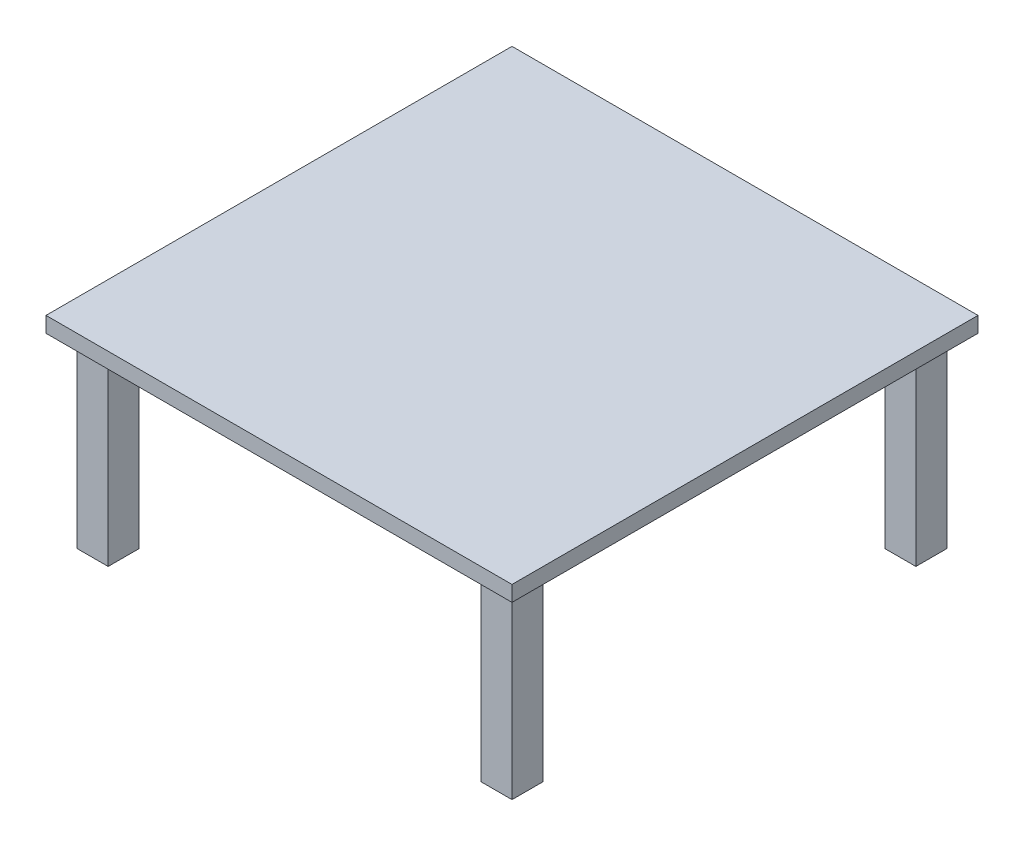
ISO-10303-21;
HEADER;
FILE_DESCRIPTION(('STEP AP214'),'2;1');
FILE_NAME('part.step','',(''),(''),'','','');
FILE_SCHEMA(('AUTOMOTIVE_DESIGN { 1 0 10303 214 1 1 1 1 }'));
ENDSEC;
DATA;
#1=APPLICATION_CONTEXT('core data for automotive mechanical design processes');
#2=APPLICATION_PROTOCOL_DEFINITION('international standard','automotive_design',2000,#1);
#3=PRODUCT_CONTEXT('',#1,'mechanical');
#4=PRODUCT('Part','Part','',(#3));
#5=PRODUCT_RELATED_PRODUCT_CATEGORY('part','',(#4));
#6=PRODUCT_DEFINITION_FORMATION('','',#4);
#7=PRODUCT_DEFINITION_CONTEXT('part definition',#1,'design');
#8=PRODUCT_DEFINITION('design','',#6,#7);
#9=PRODUCT_DEFINITION_SHAPE('','',#8);
#10=(LENGTH_UNIT() NAMED_UNIT(*) SI_UNIT(.MILLI.,.METRE.));
#11=(NAMED_UNIT(*) PLANE_ANGLE_UNIT() SI_UNIT($,.RADIAN.));
#12=(NAMED_UNIT(*) SI_UNIT($,.STERADIAN.) SOLID_ANGLE_UNIT());
#13=UNCERTAINTY_MEASURE_WITH_UNIT(LENGTH_MEASURE(1.E-05),#10,'distance_accuracy_value','');
#14=(GEOMETRIC_REPRESENTATION_CONTEXT(3) GLOBAL_UNCERTAINTY_ASSIGNED_CONTEXT((#13)) GLOBAL_UNIT_ASSIGNED_CONTEXT((#10,
#11,#12)) REPRESENTATION_CONTEXT('',''));
#15=CARTESIAN_POINT('',(0.,0.,0.));
#16=DIRECTION('',(0.,0.,1.));
#17=DIRECTION('',(1.,0.,0.));
#18=AXIS2_PLACEMENT_3D('',#15,#16,#17);
#19=CARTESIAN_POINT('',(0.,0.,0.));
#20=DIRECTION('',(0.,1.,0.));
#21=DIRECTION('',(0.,0.,1.));
#22=AXIS2_PLACEMENT_3D('',#19,#20,#21);
#23=PLANE('',#22);
#24=DIRECTION('',(1.,0.,0.));
#25=VECTOR('',#24,1.);
#26=CARTESIAN_POINT('',(14.,0.,-14.));
#27=LINE('',#26,#25);
#28=CARTESIAN_POINT('',(12.,0.,-14.));
#29=VERTEX_POINT('',#28);
#30=CARTESIAN_POINT('',(14.,0.,-14.));
#31=VERTEX_POINT('',#30);
#32=EDGE_CURVE('E191',#29,#31,#27,.T.);
#33=ORIENTED_EDGE('',*,*,#32,.F.);
#34=DIRECTION('',(0.,0.,-1.));
#35=VECTOR('',#34,1.);
#36=CARTESIAN_POINT('',(12.,0.,-14.));
#37=LINE('',#36,#35);
#38=CARTESIAN_POINT('',(12.,0.,-12.));
#39=VERTEX_POINT('',#38);
#40=EDGE_CURVE('E204',#39,#29,#37,.T.);
#41=ORIENTED_EDGE('',*,*,#40,.F.);
#42=DIRECTION('',(-1.,0.,0.));
#43=VECTOR('',#42,1.);
#44=CARTESIAN_POINT('',(14.,0.,-12.));
#45=LINE('',#44,#43);
#46=CARTESIAN_POINT('',(14.,0.,-12.));
#47=VERTEX_POINT('',#46);
#48=EDGE_CURVE('E213',#47,#39,#45,.T.);
#49=ORIENTED_EDGE('',*,*,#48,.F.);
#50=DIRECTION('',(0.,0.,1.));
#51=VECTOR('',#50,1.);
#52=CARTESIAN_POINT('',(14.,0.,-14.));
#53=LINE('',#52,#51);
#54=EDGE_CURVE('E194',#31,#47,#53,.T.);
#55=ORIENTED_EDGE('',*,*,#54,.F.);
#56=EDGE_LOOP('',(#33,#41,#49,#55));
#57=FACE_BOUND('',#56,.T.);
#58=DIRECTION('',(0.,0.,-1.));
#59=VECTOR('',#58,1.);
#60=CARTESIAN_POINT('',(-14.,0.,14.));
#61=LINE('',#60,#59);
#62=CARTESIAN_POINT('',(-14.,0.,14.));
#63=VERTEX_POINT('',#62);
#64=CARTESIAN_POINT('',(-14.,0.,12.));
#65=VERTEX_POINT('',#64);
#66=EDGE_CURVE('E262',#63,#65,#61,.T.);
#67=ORIENTED_EDGE('',*,*,#66,.F.);
#68=DIRECTION('',(-1.,0.,0.));
#69=VECTOR('',#68,1.);
#70=CARTESIAN_POINT('',(-14.,0.,14.));
#71=LINE('',#70,#69);
#72=CARTESIAN_POINT('',(-12.,0.,14.));
#73=VERTEX_POINT('',#72);
#74=EDGE_CURVE('E267',#73,#63,#71,.T.);
#75=ORIENTED_EDGE('',*,*,#74,.F.);
#76=DIRECTION('',(0.,0.,1.));
#77=VECTOR('',#76,1.);
#78=CARTESIAN_POINT('',(-12.,0.,14.));
#79=LINE('',#78,#77);
#80=CARTESIAN_POINT('',(-12.,0.,12.));
#81=VERTEX_POINT('',#80);
#82=EDGE_CURVE('E279',#81,#73,#79,.T.);
#83=ORIENTED_EDGE('',*,*,#82,.F.);
#84=DIRECTION('',(1.,0.,0.));
#85=VECTOR('',#84,1.);
#86=CARTESIAN_POINT('',(-14.,0.,12.));
#87=LINE('',#86,#85);
#88=EDGE_CURVE('E276',#65,#81,#87,.T.);
#89=ORIENTED_EDGE('',*,*,#88,.F.);
#90=EDGE_LOOP('',(#67,#75,#83,#89));
#91=FACE_BOUND('',#90,.T.);
#92=DIRECTION('',(0.,0.,-1.));
#93=VECTOR('',#92,1.);
#94=CARTESIAN_POINT('',(15.,0.,-15.));
#95=LINE('',#94,#93);
#96=CARTESIAN_POINT('',(15.,0.,15.));
#97=VERTEX_POINT('',#96);
#98=CARTESIAN_POINT('',(15.,0.,-15.));
#99=VERTEX_POINT('',#98);
#100=EDGE_CURVE('E295',#97,#99,#95,.T.);
#101=ORIENTED_EDGE('',*,*,#100,.F.);
#102=DIRECTION('',(1.,0.,0.));
#103=VECTOR('',#102,1.);
#104=CARTESIAN_POINT('',(-15.,0.,15.));
#105=LINE('',#104,#103);
#106=CARTESIAN_POINT('',(-15.,0.,15.));
#107=VERTEX_POINT('',#106);
#108=EDGE_CURVE('E300',#107,#97,#105,.T.);
#109=ORIENTED_EDGE('',*,*,#108,.F.);
#110=DIRECTION('',(0.,0.,1.));
#111=VECTOR('',#110,1.);
#112=CARTESIAN_POINT('',(-15.,0.,-15.));
#113=LINE('',#112,#111);
#114=CARTESIAN_POINT('',(-15.,0.,-15.));
#115=VERTEX_POINT('',#114);
#116=EDGE_CURVE('E311',#115,#107,#113,.T.);
#117=ORIENTED_EDGE('',*,*,#116,.F.);
#118=DIRECTION('',(-1.,0.,0.));
#119=VECTOR('',#118,1.);
#120=CARTESIAN_POINT('',(-15.,0.,-15.));
#121=LINE('',#120,#119);
#122=EDGE_CURVE('E309',#99,#115,#121,.T.);
#123=ORIENTED_EDGE('',*,*,#122,.F.);
#124=EDGE_LOOP('',(#101,#109,#117,#123));
#125=FACE_BOUND('',#124,.T.);
#126=DIRECTION('',(0.,0.,1.));
#127=VECTOR('',#126,1.);
#128=CARTESIAN_POINT('',(14.,0.,14.));
#129=LINE('',#128,#127);
#130=CARTESIAN_POINT('',(14.,0.,12.));
#131=VERTEX_POINT('',#130);
#132=CARTESIAN_POINT('',(14.,0.,14.));
#133=VERTEX_POINT('',#132);
#134=EDGE_CURVE('E229',#131,#133,#129,.T.);
#135=ORIENTED_EDGE('',*,*,#134,.F.);
#136=DIRECTION('',(1.,0.,0.));
#137=VECTOR('',#136,1.);
#138=CARTESIAN_POINT('',(14.,0.,12.));
#139=LINE('',#138,#137);
#140=CARTESIAN_POINT('',(12.,0.,12.));
#141=VERTEX_POINT('',#140);
#142=EDGE_CURVE('E234',#141,#131,#139,.T.);
#143=ORIENTED_EDGE('',*,*,#142,.F.);
#144=DIRECTION('',(0.,0.,-1.));
#145=VECTOR('',#144,1.);
#146=CARTESIAN_POINT('',(12.,0.,14.));
#147=LINE('',#146,#145);
#148=CARTESIAN_POINT('',(12.,0.,14.));
#149=VERTEX_POINT('',#148);
#150=EDGE_CURVE('E246',#149,#141,#147,.T.);
#151=ORIENTED_EDGE('',*,*,#150,.F.);
#152=DIRECTION('',(-1.,0.,0.));
#153=VECTOR('',#152,1.);
#154=CARTESIAN_POINT('',(14.,0.,14.));
#155=LINE('',#154,#153);
#156=EDGE_CURVE('E243',#133,#149,#155,.T.);
#157=ORIENTED_EDGE('',*,*,#156,.F.);
#158=EDGE_LOOP('',(#135,#143,#151,#157));
#159=FACE_BOUND('',#158,.T.);
#160=DIRECTION('',(0.,0.,-1.));
#161=VECTOR('',#160,1.);
#162=CARTESIAN_POINT('',(-14.,0.,-14.));
#163=LINE('',#162,#161);
#164=CARTESIAN_POINT('',(-14.,0.,-12.));
#165=VERTEX_POINT('',#164);
#166=CARTESIAN_POINT('',(-14.,0.,-14.));
#167=VERTEX_POINT('',#166);
#168=EDGE_CURVE('E190',#165,#167,#163,.T.);
#169=ORIENTED_EDGE('',*,*,#168,.F.);
#170=DIRECTION('',(-1.,0.,0.));
#171=VECTOR('',#170,1.);
#172=CARTESIAN_POINT('',(-14.,0.,-12.));
#173=LINE('',#172,#171);
#174=CARTESIAN_POINT('',(-12.,0.,-12.));
#175=VERTEX_POINT('',#174);
#176=EDGE_CURVE('E187',#175,#165,#173,.T.);
#177=ORIENTED_EDGE('',*,*,#176,.F.);
#178=DIRECTION('',(0.,0.,1.));
#179=VECTOR('',#178,1.);
#180=CARTESIAN_POINT('',(-12.,0.,-14.));
#181=LINE('',#180,#179);
#182=CARTESIAN_POINT('',(-12.,0.,-14.));
#183=VERTEX_POINT('',#182);
#184=EDGE_CURVE('E53',#183,#175,#181,.T.);
#185=ORIENTED_EDGE('',*,*,#184,.F.);
#186=DIRECTION('',(1.,0.,0.));
#187=VECTOR('',#186,1.);
#188=CARTESIAN_POINT('',(-14.,0.,-14.));
#189=LINE('',#188,#187);
#190=EDGE_CURVE('E48',#167,#183,#189,.T.);
#191=ORIENTED_EDGE('',*,*,#190,.F.);
#192=EDGE_LOOP('',(#169,#177,#185,#191));
#193=FACE_BOUND('',#192,.T.);
#194=ADVANCED_FACE('F33',(#57,#91,#125,#159,#193),#23,.F.);
#195=CARTESIAN_POINT('',(15.,1.,-15.));
#196=DIRECTION('',(-1.,0.,0.));
#197=DIRECTION('',(0.,0.,1.));
#198=AXIS2_PLACEMENT_3D('',#195,#196,#197);
#199=PLANE('',#198);
#200=ORIENTED_EDGE('',*,*,#100,.T.);
#201=DIRECTION('',(0.,-1.,0.));
#202=VECTOR('',#201,1.);
#203=CARTESIAN_POINT('',(15.,1.,-15.));
#204=LINE('',#203,#202);
#205=CARTESIAN_POINT('',(15.,1.,-15.));
#206=VERTEX_POINT('',#205);
#207=EDGE_CURVE('E11',#206,#99,#204,.T.);
#208=ORIENTED_EDGE('',*,*,#207,.F.);
#209=DIRECTION('',(0.,0.,-1.));
#210=VECTOR('',#209,1.);
#211=CARTESIAN_POINT('',(15.,1.,-15.));
#212=LINE('',#211,#210);
#213=CARTESIAN_POINT('',(15.,1.,15.));
#214=VERTEX_POINT('',#213);
#215=EDGE_CURVE('E296',#214,#206,#212,.T.);
#216=ORIENTED_EDGE('',*,*,#215,.F.);
#217=DIRECTION('',(0.,-1.,0.));
#218=VECTOR('',#217,1.);
#219=CARTESIAN_POINT('',(15.,1.,15.));
#220=LINE('',#219,#218);
#221=EDGE_CURVE('E306',#214,#97,#220,.T.);
#222=ORIENTED_EDGE('',*,*,#221,.T.);
#223=EDGE_LOOP('',(#200,#208,#216,#222));
#224=FACE_BOUND('',#223,.T.);
#225=ADVANCED_FACE('F35',(#224),#199,.F.);
#226=CARTESIAN_POINT('',(-15.,1.,-15.));
#227=DIRECTION('',(0.,0.,1.));
#228=DIRECTION('',(1.,0.,0.));
#229=AXIS2_PLACEMENT_3D('',#226,#227,#228);
#230=PLANE('',#229);
#231=ORIENTED_EDGE('',*,*,#122,.T.);
#232=DIRECTION('',(0.,-1.,0.));
#233=VECTOR('',#232,1.);
#234=CARTESIAN_POINT('',(-15.,1.,-15.));
#235=LINE('',#234,#233);
#236=CARTESIAN_POINT('',(-15.,1.,-15.));
#237=VERTEX_POINT('',#236);
#238=EDGE_CURVE('E41',#237,#115,#235,.T.);
#239=ORIENTED_EDGE('',*,*,#238,.F.);
#240=DIRECTION('',(-1.,0.,0.));
#241=VECTOR('',#240,1.);
#242=CARTESIAN_POINT('',(-15.,1.,-15.));
#243=LINE('',#242,#241);
#244=EDGE_CURVE('E299',#206,#237,#243,.T.);
#245=ORIENTED_EDGE('',*,*,#244,.F.);
#246=ORIENTED_EDGE('',*,*,#207,.T.);
#247=EDGE_LOOP('',(#231,#239,#245,#246));
#248=FACE_BOUND('',#247,.T.);
#249=ADVANCED_FACE('F339',(#248),#230,.F.);
#250=CARTESIAN_POINT('',(-15.,1.,-15.));
#251=DIRECTION('',(1.,0.,0.));
#252=DIRECTION('',(0.,0.,-1.));
#253=AXIS2_PLACEMENT_3D('',#250,#251,#252);
#254=PLANE('',#253);
#255=ORIENTED_EDGE('',*,*,#116,.T.);
#256=DIRECTION('',(0.,-1.,0.));
#257=VECTOR('',#256,1.);
#258=CARTESIAN_POINT('',(-15.,1.,15.));
#259=LINE('',#258,#257);
#260=CARTESIAN_POINT('',(-15.,1.,15.));
#261=VERTEX_POINT('',#260);
#262=EDGE_CURVE('E316',#261,#107,#259,.T.);
#263=ORIENTED_EDGE('',*,*,#262,.F.);
#264=DIRECTION('',(0.,0.,1.));
#265=VECTOR('',#264,1.);
#266=CARTESIAN_POINT('',(-15.,1.,-15.));
#267=LINE('',#266,#265);
#268=EDGE_CURVE('E302',#237,#261,#267,.T.);
#269=ORIENTED_EDGE('',*,*,#268,.F.);
#270=ORIENTED_EDGE('',*,*,#238,.T.);
#271=EDGE_LOOP('',(#255,#263,#269,#270));
#272=FACE_BOUND('',#271,.T.);
#273=ADVANCED_FACE('F323',(#272),#254,.F.);
#274=CARTESIAN_POINT('',(-15.,1.,15.));
#275=DIRECTION('',(0.,0.,-1.));
#276=DIRECTION('',(-1.,0.,0.));
#277=AXIS2_PLACEMENT_3D('',#274,#275,#276);
#278=PLANE('',#277);
#279=ORIENTED_EDGE('',*,*,#108,.T.);
#280=ORIENTED_EDGE('',*,*,#221,.F.);
#281=DIRECTION('',(1.,0.,0.));
#282=VECTOR('',#281,1.);
#283=CARTESIAN_POINT('',(-15.,1.,15.));
#284=LINE('',#283,#282);
#285=EDGE_CURVE('E304',#261,#214,#284,.T.);
#286=ORIENTED_EDGE('',*,*,#285,.F.);
#287=ORIENTED_EDGE('',*,*,#262,.T.);
#288=EDGE_LOOP('',(#279,#280,#286,#287));
#289=FACE_BOUND('',#288,.T.);
#290=ADVANCED_FACE('F332',(#289),#278,.F.);
#291=CARTESIAN_POINT('',(0.,1.,0.));
#292=DIRECTION('',(0.,1.,0.));
#293=DIRECTION('',(0.,0.,1.));
#294=AXIS2_PLACEMENT_3D('',#291,#292,#293);
#295=PLANE('',#294);
#296=ORIENTED_EDGE('',*,*,#215,.T.);
#297=ORIENTED_EDGE('',*,*,#244,.T.);
#298=ORIENTED_EDGE('',*,*,#268,.T.);
#299=ORIENTED_EDGE('',*,*,#285,.T.);
#300=EDGE_LOOP('',(#296,#297,#298,#299));
#301=FACE_BOUND('',#300,.T.);
#302=ADVANCED_FACE('F338',(#301),#295,.T.);
#303=CARTESIAN_POINT('',(-14.,-12.,14.));
#304=DIRECTION('',(1.,0.,0.));
#305=DIRECTION('',(0.,0.,-1.));
#306=AXIS2_PLACEMENT_3D('',#303,#304,#305);
#307=PLANE('',#306);
#308=ORIENTED_EDGE('',*,*,#66,.T.);
#309=DIRECTION('',(0.,1.,0.));
#310=VECTOR('',#309,1.);
#311=CARTESIAN_POINT('',(-14.,-12.,12.));
#312=LINE('',#311,#310);
#313=CARTESIAN_POINT('',(-14.,-12.,12.));
#314=VERTEX_POINT('',#313);
#315=EDGE_CURVE('E292',#314,#65,#312,.T.);
#316=ORIENTED_EDGE('',*,*,#315,.F.);
#317=DIRECTION('',(0.,0.,-1.));
#318=VECTOR('',#317,1.);
#319=CARTESIAN_POINT('',(-14.,-12.,14.));
#320=LINE('',#319,#318);
#321=CARTESIAN_POINT('',(-14.,-12.,14.));
#322=VERTEX_POINT('',#321);
#323=EDGE_CURVE('E263',#322,#314,#320,.T.);
#324=ORIENTED_EDGE('',*,*,#323,.F.);
#325=DIRECTION('',(0.,1.,0.));
#326=VECTOR('',#325,1.);
#327=CARTESIAN_POINT('',(-14.,-12.,14.));
#328=LINE('',#327,#326);
#329=EDGE_CURVE('E273',#322,#63,#328,.T.);
#330=ORIENTED_EDGE('',*,*,#329,.T.);
#331=EDGE_LOOP('',(#308,#316,#324,#330));
#332=FACE_BOUND('',#331,.T.);
#333=ADVANCED_FACE('F359',(#332),#307,.F.);
#334=CARTESIAN_POINT('',(-14.,-12.,12.));
#335=DIRECTION('',(0.,0.,1.));
#336=DIRECTION('',(1.,0.,0.));
#337=AXIS2_PLACEMENT_3D('',#334,#335,#336);
#338=PLANE('',#337);
#339=ORIENTED_EDGE('',*,*,#88,.T.);
#340=DIRECTION('',(0.,1.,0.));
#341=VECTOR('',#340,1.);
#342=CARTESIAN_POINT('',(-12.,-12.,12.));
#343=LINE('',#342,#341);
#344=CARTESIAN_POINT('',(-12.,-12.,12.));
#345=VERTEX_POINT('',#344);
#346=EDGE_CURVE('E289',#345,#81,#343,.T.);
#347=ORIENTED_EDGE('',*,*,#346,.F.);
#348=DIRECTION('',(1.,0.,0.));
#349=VECTOR('',#348,1.);
#350=CARTESIAN_POINT('',(-14.,-12.,12.));
#351=LINE('',#350,#349);
#352=EDGE_CURVE('E266',#314,#345,#351,.T.);
#353=ORIENTED_EDGE('',*,*,#352,.F.);
#354=ORIENTED_EDGE('',*,*,#315,.T.);
#355=EDGE_LOOP('',(#339,#347,#353,#354));
#356=FACE_BOUND('',#355,.T.);
#357=ADVANCED_FACE('F363',(#356),#338,.F.);
#358=CARTESIAN_POINT('',(-12.,-12.,14.));
#359=DIRECTION('',(-1.,0.,0.));
#360=DIRECTION('',(0.,0.,1.));
#361=AXIS2_PLACEMENT_3D('',#358,#359,#360);
#362=PLANE('',#361);
#363=ORIENTED_EDGE('',*,*,#82,.T.);
#364=DIRECTION('',(0.,1.,0.));
#365=VECTOR('',#364,1.);
#366=CARTESIAN_POINT('',(-12.,-12.,14.));
#367=LINE('',#366,#365);
#368=CARTESIAN_POINT('',(-12.,-12.,14.));
#369=VERTEX_POINT('',#368);
#370=EDGE_CURVE('E286',#369,#73,#367,.T.);
#371=ORIENTED_EDGE('',*,*,#370,.F.);
#372=DIRECTION('',(0.,0.,1.));
#373=VECTOR('',#372,1.);
#374=CARTESIAN_POINT('',(-12.,-12.,14.));
#375=LINE('',#374,#373);
#376=EDGE_CURVE('E269',#345,#369,#375,.T.);
#377=ORIENTED_EDGE('',*,*,#376,.F.);
#378=ORIENTED_EDGE('',*,*,#346,.T.);
#379=EDGE_LOOP('',(#363,#371,#377,#378));
#380=FACE_BOUND('',#379,.T.);
#381=ADVANCED_FACE('F368',(#380),#362,.F.);
#382=CARTESIAN_POINT('',(-14.,-12.,14.));
#383=DIRECTION('',(0.,0.,-1.));
#384=DIRECTION('',(-1.,0.,0.));
#385=AXIS2_PLACEMENT_3D('',#382,#383,#384);
#386=PLANE('',#385);
#387=ORIENTED_EDGE('',*,*,#74,.T.);
#388=ORIENTED_EDGE('',*,*,#329,.F.);
#389=DIRECTION('',(-1.,0.,0.));
#390=VECTOR('',#389,1.);
#391=CARTESIAN_POINT('',(-14.,-12.,14.));
#392=LINE('',#391,#390);
#393=EDGE_CURVE('E271',#369,#322,#392,.T.);
#394=ORIENTED_EDGE('',*,*,#393,.F.);
#395=ORIENTED_EDGE('',*,*,#370,.T.);
#396=EDGE_LOOP('',(#387,#388,#394,#395));
#397=FACE_BOUND('',#396,.T.);
#398=ADVANCED_FACE('F374',(#397),#386,.F.);
#399=CARTESIAN_POINT('',(0.,-12.,0.));
#400=DIRECTION('',(0.,-1.,0.));
#401=DIRECTION('',(0.,0.,-1.));
#402=AXIS2_PLACEMENT_3D('',#399,#400,#401);
#403=PLANE('',#402);
#404=ORIENTED_EDGE('',*,*,#323,.T.);
#405=ORIENTED_EDGE('',*,*,#352,.T.);
#406=ORIENTED_EDGE('',*,*,#376,.T.);
#407=ORIENTED_EDGE('',*,*,#393,.T.);
#408=EDGE_LOOP('',(#404,#405,#406,#407));
#409=FACE_BOUND('',#408,.T.);
#410=ADVANCED_FACE('F378',(#409),#403,.T.);
#411=CARTESIAN_POINT('',(14.,-12.,14.));
#412=DIRECTION('',(-1.,0.,0.));
#413=DIRECTION('',(0.,0.,1.));
#414=AXIS2_PLACEMENT_3D('',#411,#412,#413);
#415=PLANE('',#414);
#416=ORIENTED_EDGE('',*,*,#134,.T.);
#417=DIRECTION('',(0.,1.,0.));
#418=VECTOR('',#417,1.);
#419=CARTESIAN_POINT('',(14.,-12.,14.));
#420=LINE('',#419,#418);
#421=CARTESIAN_POINT('',(14.,-12.,14.));
#422=VERTEX_POINT('',#421);
#423=EDGE_CURVE('E259',#422,#133,#420,.T.);
#424=ORIENTED_EDGE('',*,*,#423,.F.);
#425=DIRECTION('',(0.,0.,1.));
#426=VECTOR('',#425,1.);
#427=CARTESIAN_POINT('',(14.,-12.,14.));
#428=LINE('',#427,#426);
#429=CARTESIAN_POINT('',(14.,-12.,12.));
#430=VERTEX_POINT('',#429);
#431=EDGE_CURVE('E230',#430,#422,#428,.T.);
#432=ORIENTED_EDGE('',*,*,#431,.F.);
#433=DIRECTION('',(0.,1.,0.));
#434=VECTOR('',#433,1.);
#435=CARTESIAN_POINT('',(14.,-12.,12.));
#436=LINE('',#435,#434);
#437=EDGE_CURVE('E240',#430,#131,#436,.T.);
#438=ORIENTED_EDGE('',*,*,#437,.T.);
#439=EDGE_LOOP('',(#416,#424,#432,#438));
#440=FACE_BOUND('',#439,.T.);
#441=ADVANCED_FACE('F382',(#440),#415,.F.);
#442=CARTESIAN_POINT('',(14.,-12.,14.));
#443=DIRECTION('',(0.,0.,-1.));
#444=DIRECTION('',(-1.,0.,0.));
#445=AXIS2_PLACEMENT_3D('',#442,#443,#444);
#446=PLANE('',#445);
#447=ORIENTED_EDGE('',*,*,#156,.T.);
#448=DIRECTION('',(0.,1.,0.));
#449=VECTOR('',#448,1.);
#450=CARTESIAN_POINT('',(12.,-12.,14.));
#451=LINE('',#450,#449);
#452=CARTESIAN_POINT('',(12.,-12.,14.));
#453=VERTEX_POINT('',#452);
#454=EDGE_CURVE('E256',#453,#149,#451,.T.);
#455=ORIENTED_EDGE('',*,*,#454,.F.);
#456=DIRECTION('',(-1.,0.,0.));
#457=VECTOR('',#456,1.);
#458=CARTESIAN_POINT('',(14.,-12.,14.));
#459=LINE('',#458,#457);
#460=EDGE_CURVE('E233',#422,#453,#459,.T.);
#461=ORIENTED_EDGE('',*,*,#460,.F.);
#462=ORIENTED_EDGE('',*,*,#423,.T.);
#463=EDGE_LOOP('',(#447,#455,#461,#462));
#464=FACE_BOUND('',#463,.T.);
#465=ADVANCED_FACE('F386',(#464),#446,.F.);
#466=CARTESIAN_POINT('',(12.,-12.,14.));
#467=DIRECTION('',(1.,0.,0.));
#468=DIRECTION('',(0.,0.,-1.));
#469=AXIS2_PLACEMENT_3D('',#466,#467,#468);
#470=PLANE('',#469);
#471=ORIENTED_EDGE('',*,*,#150,.T.);
#472=DIRECTION('',(0.,1.,0.));
#473=VECTOR('',#472,1.);
#474=CARTESIAN_POINT('',(12.,-12.,12.));
#475=LINE('',#474,#473);
#476=CARTESIAN_POINT('',(12.,-12.,12.));
#477=VERTEX_POINT('',#476);
#478=EDGE_CURVE('E253',#477,#141,#475,.T.);
#479=ORIENTED_EDGE('',*,*,#478,.F.);
#480=DIRECTION('',(0.,0.,-1.));
#481=VECTOR('',#480,1.);
#482=CARTESIAN_POINT('',(12.,-12.,14.));
#483=LINE('',#482,#481);
#484=EDGE_CURVE('E236',#453,#477,#483,.T.);
#485=ORIENTED_EDGE('',*,*,#484,.F.);
#486=ORIENTED_EDGE('',*,*,#454,.T.);
#487=EDGE_LOOP('',(#471,#479,#485,#486));
#488=FACE_BOUND('',#487,.T.);
#489=ADVANCED_FACE('F390',(#488),#470,.F.);
#490=CARTESIAN_POINT('',(14.,-12.,12.));
#491=DIRECTION('',(0.,0.,1.));
#492=DIRECTION('',(1.,0.,0.));
#493=AXIS2_PLACEMENT_3D('',#490,#491,#492);
#494=PLANE('',#493);
#495=ORIENTED_EDGE('',*,*,#142,.T.);
#496=ORIENTED_EDGE('',*,*,#437,.F.);
#497=DIRECTION('',(1.,0.,0.));
#498=VECTOR('',#497,1.);
#499=CARTESIAN_POINT('',(14.,-12.,12.));
#500=LINE('',#499,#498);
#501=EDGE_CURVE('E238',#477,#430,#500,.T.);
#502=ORIENTED_EDGE('',*,*,#501,.F.);
#503=ORIENTED_EDGE('',*,*,#478,.T.);
#504=EDGE_LOOP('',(#495,#496,#502,#503));
#505=FACE_BOUND('',#504,.T.);
#506=ADVANCED_FACE('F394',(#505),#494,.F.);
#507=CARTESIAN_POINT('',(0.,-12.,0.));
#508=DIRECTION('',(0.,1.,0.));
#509=DIRECTION('',(0.,0.,1.));
#510=AXIS2_PLACEMENT_3D('',#507,#508,#509);
#511=PLANE('',#510);
#512=ORIENTED_EDGE('',*,*,#431,.T.);
#513=ORIENTED_EDGE('',*,*,#460,.T.);
#514=ORIENTED_EDGE('',*,*,#484,.T.);
#515=ORIENTED_EDGE('',*,*,#501,.T.);
#516=EDGE_LOOP('',(#512,#513,#514,#515));
#517=FACE_BOUND('',#516,.T.);
#518=ADVANCED_FACE('F398',(#517),#511,.F.);
#519=CARTESIAN_POINT('',(14.,-12.,-14.));
#520=DIRECTION('',(0.,0.,1.));
#521=DIRECTION('',(1.,0.,0.));
#522=AXIS2_PLACEMENT_3D('',#519,#520,#521);
#523=PLANE('',#522);
#524=ORIENTED_EDGE('',*,*,#32,.T.);
#525=DIRECTION('',(0.,1.,0.));
#526=VECTOR('',#525,1.);
#527=CARTESIAN_POINT('',(14.,-12.,-14.));
#528=LINE('',#527,#526);
#529=CARTESIAN_POINT('',(14.,-12.,-14.));
#530=VERTEX_POINT('',#529);
#531=EDGE_CURVE('E226',#530,#31,#528,.T.);
#532=ORIENTED_EDGE('',*,*,#531,.F.);
#533=DIRECTION('',(1.,0.,0.));
#534=VECTOR('',#533,1.);
#535=CARTESIAN_POINT('',(14.,-12.,-14.));
#536=LINE('',#535,#534);
#537=CARTESIAN_POINT('',(12.,-12.,-14.));
#538=VERTEX_POINT('',#537);
#539=EDGE_CURVE('E200',#538,#530,#536,.T.);
#540=ORIENTED_EDGE('',*,*,#539,.F.);
#541=DIRECTION('',(0.,1.,0.));
#542=VECTOR('',#541,1.);
#543=CARTESIAN_POINT('',(12.,-12.,-14.));
#544=LINE('',#543,#542);
#545=EDGE_CURVE('E209',#538,#29,#544,.T.);
#546=ORIENTED_EDGE('',*,*,#545,.T.);
#547=EDGE_LOOP('',(#524,#532,#540,#546));
#548=FACE_BOUND('',#547,.T.);
#549=ADVANCED_FACE('F402',(#548),#523,.F.);
#550=CARTESIAN_POINT('',(14.,-12.,-14.));
#551=DIRECTION('',(-1.,0.,0.));
#552=DIRECTION('',(0.,0.,1.));
#553=AXIS2_PLACEMENT_3D('',#550,#551,#552);
#554=PLANE('',#553);
#555=ORIENTED_EDGE('',*,*,#54,.T.);
#556=DIRECTION('',(0.,1.,0.));
#557=VECTOR('',#556,1.);
#558=CARTESIAN_POINT('',(14.,-12.,-12.));
#559=LINE('',#558,#557);
#560=CARTESIAN_POINT('',(14.,-12.,-12.));
#561=VERTEX_POINT('',#560);
#562=EDGE_CURVE('E223',#561,#47,#559,.T.);
#563=ORIENTED_EDGE('',*,*,#562,.F.);
#564=DIRECTION('',(0.,0.,1.));
#565=VECTOR('',#564,1.);
#566=CARTESIAN_POINT('',(14.,-12.,-14.));
#567=LINE('',#566,#565);
#568=EDGE_CURVE('E203',#530,#561,#567,.T.);
#569=ORIENTED_EDGE('',*,*,#568,.F.);
#570=ORIENTED_EDGE('',*,*,#531,.T.);
#571=EDGE_LOOP('',(#555,#563,#569,#570));
#572=FACE_BOUND('',#571,.T.);
#573=ADVANCED_FACE('F406',(#572),#554,.F.);
#574=CARTESIAN_POINT('',(14.,-12.,-12.));
#575=DIRECTION('',(0.,0.,-1.));
#576=DIRECTION('',(-1.,0.,0.));
#577=AXIS2_PLACEMENT_3D('',#574,#575,#576);
#578=PLANE('',#577);
#579=ORIENTED_EDGE('',*,*,#48,.T.);
#580=DIRECTION('',(0.,1.,0.));
#581=VECTOR('',#580,1.);
#582=CARTESIAN_POINT('',(12.,-12.,-12.));
#583=LINE('',#582,#581);
#584=CARTESIAN_POINT('',(12.,-12.,-12.));
#585=VERTEX_POINT('',#584);
#586=EDGE_CURVE('E220',#585,#39,#583,.T.);
#587=ORIENTED_EDGE('',*,*,#586,.F.);
#588=DIRECTION('',(-1.,0.,0.));
#589=VECTOR('',#588,1.);
#590=CARTESIAN_POINT('',(14.,-12.,-12.));
#591=LINE('',#590,#589);
#592=EDGE_CURVE('E206',#561,#585,#591,.T.);
#593=ORIENTED_EDGE('',*,*,#592,.F.);
#594=ORIENTED_EDGE('',*,*,#562,.T.);
#595=EDGE_LOOP('',(#579,#587,#593,#594));
#596=FACE_BOUND('',#595,.T.);
#597=ADVANCED_FACE('F410',(#596),#578,.F.);
#598=CARTESIAN_POINT('',(12.,-12.,-14.));
#599=DIRECTION('',(1.,0.,0.));
#600=DIRECTION('',(0.,0.,-1.));
#601=AXIS2_PLACEMENT_3D('',#598,#599,#600);
#602=PLANE('',#601);
#603=ORIENTED_EDGE('',*,*,#40,.T.);
#604=ORIENTED_EDGE('',*,*,#545,.F.);
#605=DIRECTION('',(0.,0.,-1.));
#606=VECTOR('',#605,1.);
#607=CARTESIAN_POINT('',(12.,-12.,-14.));
#608=LINE('',#607,#606);
#609=EDGE_CURVE('E208',#585,#538,#608,.T.);
#610=ORIENTED_EDGE('',*,*,#609,.F.);
#611=ORIENTED_EDGE('',*,*,#586,.T.);
#612=EDGE_LOOP('',(#603,#604,#610,#611));
#613=FACE_BOUND('',#612,.T.);
#614=ADVANCED_FACE('F414',(#613),#602,.F.);
#615=CARTESIAN_POINT('',(0.,-12.,0.));
#616=DIRECTION('',(0.,1.,0.));
#617=DIRECTION('',(0.,0.,1.));
#618=AXIS2_PLACEMENT_3D('',#615,#616,#617);
#619=PLANE('',#618);
#620=ORIENTED_EDGE('',*,*,#539,.T.);
#621=ORIENTED_EDGE('',*,*,#568,.T.);
#622=ORIENTED_EDGE('',*,*,#592,.T.);
#623=ORIENTED_EDGE('',*,*,#609,.T.);
#624=EDGE_LOOP('',(#620,#621,#622,#623));
#625=FACE_BOUND('',#624,.T.);
#626=ADVANCED_FACE('F418',(#625),#619,.F.);
#627=CARTESIAN_POINT('',(-14.,-12.,-14.));
#628=DIRECTION('',(1.,0.,0.));
#629=DIRECTION('',(0.,0.,-1.));
#630=AXIS2_PLACEMENT_3D('',#627,#628,#629);
#631=PLANE('',#630);
#632=ORIENTED_EDGE('',*,*,#168,.T.);
#633=DIRECTION('',(0.,1.,0.));
#634=VECTOR('',#633,1.);
#635=CARTESIAN_POINT('',(-14.,-12.,-14.));
#636=LINE('',#635,#634);
#637=CARTESIAN_POINT('',(-14.,-12.,-14.));
#638=VERTEX_POINT('',#637);
#639=EDGE_CURVE('E171',#638,#167,#636,.T.);
#640=ORIENTED_EDGE('',*,*,#639,.F.);
#641=DIRECTION('',(0.,0.,-1.));
#642=VECTOR('',#641,1.);
#643=CARTESIAN_POINT('',(-14.,-12.,-14.));
#644=LINE('',#643,#642);
#645=CARTESIAN_POINT('',(-14.,-12.,-12.));
#646=VERTEX_POINT('',#645);
#647=EDGE_CURVE('E178',#646,#638,#644,.T.);
#648=ORIENTED_EDGE('',*,*,#647,.F.);
#649=DIRECTION('',(0.,1.,0.));
#650=VECTOR('',#649,1.);
#651=CARTESIAN_POINT('',(-14.,-12.,-12.));
#652=LINE('',#651,#650);
#653=EDGE_CURVE('E584',#646,#165,#652,.T.);
#654=ORIENTED_EDGE('',*,*,#653,.T.);
#655=EDGE_LOOP('',(#632,#640,#648,#654));
#656=FACE_BOUND('',#655,.T.);
#657=ADVANCED_FACE('F189',(#656),#631,.F.);
#658=CARTESIAN_POINT('',(-14.,-12.,-14.));
#659=DIRECTION('',(0.,0.,1.));
#660=DIRECTION('',(1.,0.,0.));
#661=AXIS2_PLACEMENT_3D('',#658,#659,#660);
#662=PLANE('',#661);
#663=ORIENTED_EDGE('',*,*,#190,.T.);
#664=DIRECTION('',(0.,1.,0.));
#665=VECTOR('',#664,1.);
#666=CARTESIAN_POINT('',(-12.,-12.,-14.));
#667=LINE('',#666,#665);
#668=CARTESIAN_POINT('',(-12.,-12.,-14.));
#669=VERTEX_POINT('',#668);
#670=EDGE_CURVE('E174',#669,#183,#667,.T.);
#671=ORIENTED_EDGE('',*,*,#670,.F.);
#672=DIRECTION('',(1.,0.,0.));
#673=VECTOR('',#672,1.);
#674=CARTESIAN_POINT('',(-14.,-12.,-14.));
#675=LINE('',#674,#673);
#676=EDGE_CURVE('E167',#638,#669,#675,.T.);
#677=ORIENTED_EDGE('',*,*,#676,.F.);
#678=ORIENTED_EDGE('',*,*,#639,.T.);
#679=EDGE_LOOP('',(#663,#671,#677,#678));
#680=FACE_BOUND('',#679,.T.);
#681=ADVANCED_FACE('F169',(#680),#662,.F.);
#682=CARTESIAN_POINT('',(-12.,-12.,-14.));
#683=DIRECTION('',(-1.,0.,0.));
#684=DIRECTION('',(0.,0.,1.));
#685=AXIS2_PLACEMENT_3D('',#682,#683,#684);
#686=PLANE('',#685);
#687=ORIENTED_EDGE('',*,*,#184,.T.);
#688=DIRECTION('',(0.,1.,0.));
#689=VECTOR('',#688,1.);
#690=CARTESIAN_POINT('',(-12.,-12.,-12.));
#691=LINE('',#690,#689);
#692=CARTESIAN_POINT('',(-12.,-12.,-12.));
#693=VERTEX_POINT('',#692);
#694=EDGE_CURVE('E196',#693,#175,#691,.T.);
#695=ORIENTED_EDGE('',*,*,#694,.F.);
#696=DIRECTION('',(0.,0.,1.));
#697=VECTOR('',#696,1.);
#698=CARTESIAN_POINT('',(-12.,-12.,-14.));
#699=LINE('',#698,#697);
#700=EDGE_CURVE('E177',#669,#693,#699,.T.);
#701=ORIENTED_EDGE('',*,*,#700,.F.);
#702=ORIENTED_EDGE('',*,*,#670,.T.);
#703=EDGE_LOOP('',(#687,#695,#701,#702));
#704=FACE_BOUND('',#703,.T.);
#705=ADVANCED_FACE('F427',(#704),#686,.F.);
#706=CARTESIAN_POINT('',(-14.,-12.,-12.));
#707=DIRECTION('',(0.,0.,-1.));
#708=DIRECTION('',(-1.,0.,0.));
#709=AXIS2_PLACEMENT_3D('',#706,#707,#708);
#710=PLANE('',#709);
#711=ORIENTED_EDGE('',*,*,#176,.T.);
#712=ORIENTED_EDGE('',*,*,#653,.F.);
#713=DIRECTION('',(-1.,0.,0.));
#714=VECTOR('',#713,1.);
#715=CARTESIAN_POINT('',(-14.,-12.,-12.));
#716=LINE('',#715,#714);
#717=EDGE_CURVE('E183',#693,#646,#716,.T.);
#718=ORIENTED_EDGE('',*,*,#717,.F.);
#719=ORIENTED_EDGE('',*,*,#694,.T.);
#720=EDGE_LOOP('',(#711,#712,#718,#719));
#721=FACE_BOUND('',#720,.T.);
#722=ADVANCED_FACE('F430',(#721),#710,.F.);
#723=CARTESIAN_POINT('',(0.,-12.,0.));
#724=DIRECTION('',(0.,1.,0.));
#725=DIRECTION('',(0.,0.,1.));
#726=AXIS2_PLACEMENT_3D('',#723,#724,#725);
#727=PLANE('',#726);
#728=ORIENTED_EDGE('',*,*,#647,.T.);
#729=ORIENTED_EDGE('',*,*,#676,.T.);
#730=ORIENTED_EDGE('',*,*,#700,.T.);
#731=ORIENTED_EDGE('',*,*,#717,.T.);
#732=EDGE_LOOP('',(#728,#729,#730,#731));
#733=FACE_BOUND('',#732,.T.);
#734=ADVANCED_FACE('F181',(#733),#727,.F.);
#735=CLOSED_SHELL('',(#194,#225,#249,#273,#290,#302,#333,#357,#381,#398,#410,#441,#465,#489,
#506,#518,#549,#573,#597,#614,#626,#657,#681,#705,#722,#734));
#736=MANIFOLD_SOLID_BREP('B2',#735);
#737=ADVANCED_BREP_SHAPE_REPRESENTATION('',(#18,#736),#14);
#738=SHAPE_DEFINITION_REPRESENTATION(#9,#737);
ENDSEC;
END-ISO-10303-21;
